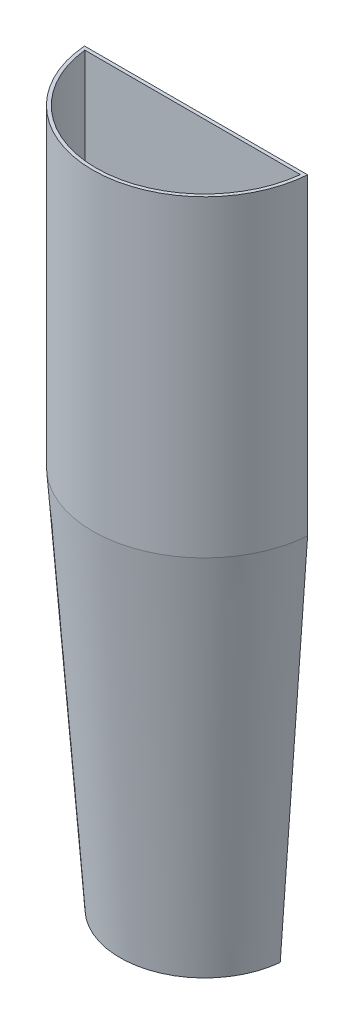
ISO-10303-21;
HEADER;
FILE_DESCRIPTION(('STEP AP214'),'2;1');
FILE_NAME('part.step','',(''),(''),'','','');
FILE_SCHEMA(('AUTOMOTIVE_DESIGN { 1 0 10303 214 1 1 1 1 }'));
ENDSEC;
DATA;
#1=APPLICATION_CONTEXT('core data for automotive mechanical design processes');
#2=APPLICATION_PROTOCOL_DEFINITION('international standard','automotive_design',2000,#1);
#3=PRODUCT_CONTEXT('',#1,'mechanical');
#4=PRODUCT('Part','Part','',(#3));
#5=PRODUCT_RELATED_PRODUCT_CATEGORY('part','',(#4));
#6=PRODUCT_DEFINITION_FORMATION('','',#4);
#7=PRODUCT_DEFINITION_CONTEXT('part definition',#1,'design');
#8=PRODUCT_DEFINITION('design','',#6,#7);
#9=PRODUCT_DEFINITION_SHAPE('','',#8);
#10=(LENGTH_UNIT() NAMED_UNIT(*) SI_UNIT(.MILLI.,.METRE.));
#11=(NAMED_UNIT(*) PLANE_ANGLE_UNIT() SI_UNIT($,.RADIAN.));
#12=(NAMED_UNIT(*) SI_UNIT($,.STERADIAN.) SOLID_ANGLE_UNIT());
#13=UNCERTAINTY_MEASURE_WITH_UNIT(LENGTH_MEASURE(1.E-05),#10,'distance_accuracy_value','');
#14=(GEOMETRIC_REPRESENTATION_CONTEXT(3) GLOBAL_UNCERTAINTY_ASSIGNED_CONTEXT((#13)) GLOBAL_UNIT_ASSIGNED_CONTEXT((#10,
#11,#12)) REPRESENTATION_CONTEXT('',''));
#15=CARTESIAN_POINT('',(0.,0.,0.));
#16=DIRECTION('',(0.,0.,1.));
#17=DIRECTION('',(1.,0.,0.));
#18=AXIS2_PLACEMENT_3D('',#15,#16,#17);
#19=CARTESIAN_POINT('',(15.85,91.39,-1.66990534356155E-13));
#20=DIRECTION('',(0.,1.,0.));
#21=DIRECTION('',(0.,0.,1.));
#22=AXIS2_PLACEMENT_3D('',#19,#20,#21);
#23=PLANE('',#22);
#24=DIRECTION('',(1.,0.,0.));
#25=VECTOR('',#24,1.);
#26=CARTESIAN_POINT('',(15.85,91.39,2.50000000000001));
#27=LINE('',#26,#25);
#28=CARTESIAN_POINT('',(-32.6042941957037,91.39,2.50000000000001));
#29=VERTEX_POINT('',#28);
#30=CARTESIAN_POINT('',(32.6042941957037,91.39,2.50000000000001));
#31=VERTEX_POINT('',#30);
#32=EDGE_CURVE('E36',#29,#31,#27,.T.);
#33=ORIENTED_EDGE('',*,*,#32,.F.);
#34=CARTESIAN_POINT('',(0.,91.39,0.));
#35=DIRECTION('',(0.,1.,0.));
#36=DIRECTION('',(0.,0.,1.));
#37=AXIS2_PLACEMENT_3D('',#34,#35,#36);
#38=CIRCLE('',#37,32.7);
#39=EDGE_CURVE('E105',#31,#29,#38,.F.);
#40=ORIENTED_EDGE('',*,*,#39,.F.);
#41=EDGE_LOOP('',(#33,#40));
#42=FACE_BOUND('',#41,.T.);
#43=CARTESIAN_POINT('',(0.,91.39,0.));
#44=DIRECTION('',(0.,-1.,0.));
#45=DIRECTION('',(0.,0.,-1.));
#46=AXIS2_PLACEMENT_3D('',#43,#44,#45);
#47=CIRCLE('',#46,31.7);
#48=CARTESIAN_POINT('',(31.5061898680243,91.39,3.50000000000001));
#49=VERTEX_POINT('',#48);
#50=CARTESIAN_POINT('',(-31.5061898680243,91.39,3.50000000000001));
#51=VERTEX_POINT('',#50);
#52=EDGE_CURVE('E177',#49,#51,#47,.T.);
#53=ORIENTED_EDGE('',*,*,#52,.T.);
#54=DIRECTION('',(1.,0.,0.));
#55=VECTOR('',#54,1.);
#56=CARTESIAN_POINT('',(-31.7,91.39,3.50000000000001));
#57=LINE('',#56,#55);
#58=EDGE_CURVE('E49',#51,#49,#57,.T.);
#59=ORIENTED_EDGE('',*,*,#58,.T.);
#60=EDGE_LOOP('',(#53,#59));
#61=FACE_BOUND('',#60,.T.);
#62=ADVANCED_FACE('F32',(#42,#61),#23,.T.);
#63=CARTESIAN_POINT('',(0.,91.39,0.));
#64=DIRECTION('',(0.,-1.,0.));
#65=DIRECTION('',(0.,0.,-1.));
#66=AXIS2_PLACEMENT_3D('',#63,#64,#65);
#67=CYLINDRICAL_SURFACE('',#66,32.7);
#68=DIRECTION('',(0.,-1.,0.));
#69=VECTOR('',#68,1.);
#70=CARTESIAN_POINT('',(-32.6042941957037,-0.0355406361223097,2.50000000000001));
#71=LINE('',#70,#69);
#72=CARTESIAN_POINT('',(-32.6042941957037,-0.0355406361223097,2.50000000000001));
#73=VERTEX_POINT('',#72);
#74=EDGE_CURVE('E72',#73,#29,#71,.F.);
#75=ORIENTED_EDGE('',*,*,#74,.F.);
#76=CARTESIAN_POINT('',(0.,-0.0355406361223057,0.));
#77=DIRECTION('',(0.,1.,0.));
#78=DIRECTION('',(-1.,0.,0.));
#79=AXIS2_PLACEMENT_3D('',#76,#77,#78);
#80=CIRCLE('',#79,32.7);
#81=CARTESIAN_POINT('',(32.6042941957037,-0.0355406361223017,2.50000000000001));
#82=VERTEX_POINT('',#81);
#83=EDGE_CURVE('E41',#82,#73,#80,.F.);
#84=ORIENTED_EDGE('',*,*,#83,.F.);
#85=DIRECTION('',(0.,-1.,0.));
#86=VECTOR('',#85,1.);
#87=CARTESIAN_POINT('',(32.6042941957037,91.39,2.50000000000001));
#88=LINE('',#87,#86);
#89=EDGE_CURVE('E88',#31,#82,#88,.T.);
#90=ORIENTED_EDGE('',*,*,#89,.F.);
#91=ORIENTED_EDGE('',*,*,#39,.T.);
#92=EDGE_LOOP('',(#75,#84,#90,#91));
#93=FACE_BOUND('',#92,.T.);
#94=ADVANCED_FACE('F104',(#93),#67,.T.);
#95=CARTESIAN_POINT('',(0.,-0.0709916001408615,0.));
#96=DIRECTION('',(0.,1.,0.));
#97=DIRECTION('',(-1.,0.,0.));
#98=AXIS2_PLACEMENT_3D('',#95,#96,#97);
#99=CONICAL_SURFACE('',#98,32.6974769133717,0.0710513664491259);
#100=ORIENTED_EDGE('',*,*,#83,.T.);
#101=CARTESIAN_POINT('',(-32.6042941957037,-0.0355406361223097,2.50000000000001));
#102=CARTESIAN_POINT('',(-31.8796646662161,-10.1871954413246,2.50000000000001));
#103=CARTESIAN_POINT('',(-31.1549014916547,-20.3388407097097,2.50000000000001));
#104=CARTESIAN_POINT('',(-29.7050277711915,-40.6421064230403,2.50000000000001));
#105=CARTESIAN_POINT('',(-28.9799172252902,-50.7937268679859,2.50000000000001));
#106=CARTESIAN_POINT('',(-27.6466218046849,-69.4544682615629,2.50000000000001));
#107=CARTESIAN_POINT('',(-27.0385004948218,-77.9635937516011,2.50000000000001));
#108=CARTESIAN_POINT('',(-25.8218855314386,-94.9818181245981,2.50000000000001));
#109=CARTESIAN_POINT('',(-25.2133918779179,-103.490917007557,2.50000000000001));
#110=CARTESIAN_POINT('',(-24.6046760442116,-112.,2.50000000000001));
#111=B_SPLINE_CURVE_WITH_KNOTS('',3,(#101,#102,#103,#104,#105,#106,#107,#108,#109,#110),
.UNSPECIFIED.,.F.,.F.,(4,2,2,2,4),(0.,30.5324523966678,61.0649047427838,86.6573890459346,
112.24987338471),.UNSPECIFIED.);
#112=CARTESIAN_POINT('',(-24.6046760442116,-112.,2.50000000000001));
#113=VERTEX_POINT('',#112);
#114=EDGE_CURVE('E94',#73,#113,#111,.T.);
#115=ORIENTED_EDGE('',*,*,#114,.T.);
#116=CARTESIAN_POINT('',(0.,-112.,0.));
#117=DIRECTION('',(0.,1.,0.));
#118=DIRECTION('',(-1.,0.,0.));
#119=AXIS2_PLACEMENT_3D('',#116,#117,#118);
#120=CIRCLE('',#119,24.7313582975258);
#121=CARTESIAN_POINT('',(24.6046760442116,-112.,2.50000000000001));
#122=VERTEX_POINT('',#121);
#123=EDGE_CURVE('E102',#122,#113,#120,.F.);
#124=ORIENTED_EDGE('',*,*,#123,.F.);
#125=CARTESIAN_POINT('',(24.6046760442116,-112.,2.50000000000001));
#126=CARTESIAN_POINT('',(25.1539194026096,-104.322280968585,2.50000000000001));
#127=CARTESIAN_POINT('',(25.7029806349068,-96.6445489109409,2.50000000000001));
#128=CARTESIAN_POINT('',(26.8007940003568,-81.2890627067109,2.50000000000001));
#129=CARTESIAN_POINT('',(27.3495461335101,-73.6113085601257,2.50000000000001));
#130=CARTESIAN_POINT('',(28.6829744699763,-54.9505766646192,2.50000000000001));
#131=CARTESIAN_POINT('',(29.4675178216802,-43.9675894230161,2.50000000000001));
#132=CARTESIAN_POINT('',(31.0361903112646,-22.0015853383224,2.50000000000001));
#133=CARTESIAN_POINT('',(31.8203194491444,-11.0185684952317,2.50000000000001));
#134=CARTESIAN_POINT('',(32.6042941957037,-0.0355406361223134,2.50000000000001));
#135=B_SPLINE_CURVE_WITH_KNOTS('',3,(#125,#126,#127,#128,#129,#130,#131,#132,#133,#134),
.UNSPECIFIED.,.F.,.F.,(4,2,2,2,4),(0.,23.0920189644888,46.1840378992673,79.2169556116259,
112.249873384733),.UNSPECIFIED.);
#136=EDGE_CURVE('E58',#122,#82,#135,.T.);
#137=ORIENTED_EDGE('',*,*,#136,.T.);
#138=EDGE_LOOP('',(#100,#115,#124,#137));
#139=FACE_BOUND('',#138,.T.);
#140=ADVANCED_FACE('F99',(#139),#99,.T.);
#141=CARTESIAN_POINT('',(15.85,-112.,-1.17718836523291E-13));
#142=DIRECTION('',(0.,1.,0.));
#143=DIRECTION('',(-1.,0.,0.));
#144=AXIS2_PLACEMENT_3D('',#141,#142,#143);
#145=PLANE('',#144);
#146=ORIENTED_EDGE('',*,*,#123,.T.);
#147=DIRECTION('',(1.,0.,0.));
#148=VECTOR('',#147,1.);
#149=CARTESIAN_POINT('',(15.85,-112.,2.50000000000001));
#150=LINE('',#149,#148);
#151=EDGE_CURVE('E11',#113,#122,#150,.T.);
#152=ORIENTED_EDGE('',*,*,#151,.T.);
#153=EDGE_LOOP('',(#146,#152));
#154=FACE_BOUND('',#153,.T.);
#155=ADVANCED_FACE('F34',(#154),#145,.F.);
#156=CARTESIAN_POINT('',(-31.7,-111.,2.50000000000001));
#157=DIRECTION('',(0.,0.,1.));
#158=DIRECTION('',(1.,0.,0.));
#159=AXIS2_PLACEMENT_3D('',#156,#157,#158);
#160=PLANE('',#159);
#161=ORIENTED_EDGE('',*,*,#74,.T.);
#162=ORIENTED_EDGE('',*,*,#32,.T.);
#163=ORIENTED_EDGE('',*,*,#89,.T.);
#164=ORIENTED_EDGE('',*,*,#136,.F.);
#165=ORIENTED_EDGE('',*,*,#151,.F.);
#166=ORIENTED_EDGE('',*,*,#114,.F.);
#167=EDGE_LOOP('',(#161,#162,#163,#164,#165,#166));
#168=FACE_BOUND('',#167,.T.);
#169=ADVANCED_FACE('F89',(#168),#160,.F.);
#170=CARTESIAN_POINT('',(0.,91.39,0.));
#171=DIRECTION('',(0.,-1.,0.));
#172=DIRECTION('',(0.,0.,-1.));
#173=AXIS2_PLACEMENT_3D('',#170,#171,#172);
#174=CYLINDRICAL_SURFACE('',#173,31.7);
#175=DIRECTION('',(0.,-1.,0.));
#176=VECTOR('',#175,1.);
#177=CARTESIAN_POINT('',(-31.5061898680243,91.39,3.50000000000001));
#178=LINE('',#177,#176);
#179=CARTESIAN_POINT('',(-31.5061898680244,0.,3.50000000000001));
#180=VERTEX_POINT('',#179);
#181=EDGE_CURVE('E158',#180,#51,#178,.F.);
#182=ORIENTED_EDGE('',*,*,#181,.T.);
#183=ORIENTED_EDGE('',*,*,#52,.F.);
#184=DIRECTION('',(0.,-1.,0.));
#185=VECTOR('',#184,1.);
#186=CARTESIAN_POINT('',(31.5061898680243,91.39,3.50000000000001));
#187=LINE('',#186,#185);
#188=CARTESIAN_POINT('',(31.5061898680243,0.,3.50000000000001));
#189=VERTEX_POINT('',#188);
#190=EDGE_CURVE('E159',#49,#189,#187,.T.);
#191=ORIENTED_EDGE('',*,*,#190,.T.);
#192=CARTESIAN_POINT('',(0.,0.,0.));
#193=DIRECTION('',(0.,-1.,0.));
#194=DIRECTION('',(0.,0.,-1.));
#195=AXIS2_PLACEMENT_3D('',#192,#193,#194);
#196=CIRCLE('',#195,31.7);
#197=EDGE_CURVE('E175',#189,#180,#196,.T.);
#198=ORIENTED_EDGE('',*,*,#197,.T.);
#199=EDGE_LOOP('',(#182,#183,#191,#198));
#200=FACE_BOUND('',#199,.T.);
#201=ADVANCED_FACE('F120',(#200),#174,.F.);
#202=CARTESIAN_POINT('',(0.,0.,0.));
#203=DIRECTION('',(0.,1.,0.));
#204=DIRECTION('',(-1.,0.,0.));
#205=AXIS2_PLACEMENT_3D('',#202,#203,#204);
#206=CONICAL_SURFACE('',#205,31.7,0.0710513664491259);
#207=ORIENTED_EDGE('',*,*,#197,.F.);
#208=CARTESIAN_POINT('',(7.40743215241588,-330.292685025087,3.50000000000001));
#209=CARTESIAN_POINT('',(7.60750375181691,-327.750668811219,3.50000000000001));
#210=CARTESIAN_POINT('',(7.80615851352526,-325.208541645593,3.50000000000001));
#211=CARTESIAN_POINT('',(8.20112208021932,-320.124106876988,3.50000000000001));
#212=CARTESIAN_POINT('',(8.39743088692407,-317.581799274141,3.50000000000001));
#213=CARTESIAN_POINT('',(8.98357085077345,-309.954656393766,3.50000000000001));
#214=CARTESIAN_POINT('',(9.37061507972266,-304.869607070101,3.50000000000001));
#215=CARTESIAN_POINT('',(10.1396288583504,-294.699124401394,3.50000000000001));
#216=CARTESIAN_POINT('',(10.5215984068358,-289.613691056262,3.50000000000001));
#217=CARTESIAN_POINT('',(11.2818815336817,-279.442544511999,3.50000000000001));
#218=CARTESIAN_POINT('',(11.6601951072089,-274.356831312507,3.50000000000001));
#219=CARTESIAN_POINT('',(12.4141007246417,-264.185203899083,3.50000000000001));
#220=CARTESIAN_POINT('',(12.7896927688346,-259.099289685172,3.50000000000001));
#221=CARTESIAN_POINT('',(13.6242719984877,-247.76664358281,3.50000000000001));
#222=CARTESIAN_POINT('',(14.0827301927276,-241.519872751137,3.50000000000001));
#223=CARTESIAN_POINT('',(14.9973186309021,-229.026160620422,3.50000000000001));
#224=CARTESIAN_POINT('',(15.4534488747787,-222.779219321376,3.50000000000001));
#225=CARTESIAN_POINT('',(16.3639280898085,-210.28520630358,3.50000000000001));
#226=CARTESIAN_POINT('',(16.8182770607775,-204.038134584818,3.50000000000001));
#227=CARTESIAN_POINT('',(17.7255788428913,-191.543889746126,3.50000000000001));
#228=CARTESIAN_POINT('',(18.1785316540264,-185.296716626196,3.50000000000001));
#229=CARTESIAN_POINT('',(19.535735960926,-166.555084469971,3.50000000000001));
#230=CARTESIAN_POINT('',(20.4383338353965,-154.060505694784,3.50000000000001));
#231=CARTESIAN_POINT('',(22.2406114924065,-129.071138450109,3.50000000000001));
#232=CARTESIAN_POINT('',(23.1402912750919,-116.576349980632,3.50000000000001));
#233=CARTESIAN_POINT('',(24.5813167812165,-96.5402479786103,3.50000000000001));
#234=CARTESIAN_POINT('',(25.1233180366835,-88.9989815827312,3.50000000000001));
#235=CARTESIAN_POINT('',(26.2066983868687,-73.916403614667,3.50000000000001));
#236=CARTESIAN_POINT('',(26.7480774815469,-66.375092042479,3.50000000000001));
#237=CARTESIAN_POINT('',(28.3714450659446,-43.7511010838688,3.50000000000001));
#238=CARTESIAN_POINT('',(29.4526637835156,-28.668366464035,3.50000000000001));
#239=CARTESIAN_POINT('',(31.6136391081764,1.49720755546604,3.50000000000001));
#240=CARTESIAN_POINT('',(32.6933957152603,16.5800469551336,3.50000000000001));
#241=CARTESIAN_POINT('',(34.8518277838313,46.7458005638999,3.50000000000001));
#242=CARTESIAN_POINT('',(35.9305032454998,61.8287147729857,3.50000000000001));
#243=CARTESIAN_POINT('',(38.0870165379709,91.9946029503444,3.50000000000001));
#244=CARTESIAN_POINT('',(39.1648543687804,107.077576918617,3.50000000000001));
#245=CARTESIAN_POINT('',(40.2423950596724,122.160572100045,3.50000000000001));
#246=B_SPLINE_CURVE_WITH_KNOTS('',3,(#208,#209,#210,#211,#212,#213,#214,#215,#216,#217,#218,
#219,#220,#221,#222,#223,#224,#225,#226,#227,#228,#229,#230,#231,#232,#233,#234,#235,#236,#237,
#238,#239,#240,#241,#242,#243,#244,#245),.UNSPECIFIED.,.F.,.F.,(4,2,2,2,2,2,2,2,2,2,2,2,2,2,2,2,
2,2,4),(0.,7.6496311639932,15.2992567222061,30.5985259710737,45.8977988168493,61.1970918862972,
76.4963833411445,95.2870976535314,114.077812432906,132.868529153757,151.659246005518,
189.240658826593,226.822069767094,249.504225236098,272.186382166761,317.5506990618,
362.915016139829,408.2793256101,453.643634709232),.UNSPECIFIED.);
#247=CARTESIAN_POINT('',(23.5412404091203,-111.,3.50000000000001));
#248=VERTEX_POINT('',#247);
#249=EDGE_CURVE('E81',#248,#189,#246,.T.);
#250=ORIENTED_EDGE('',*,*,#249,.F.);
#251=CARTESIAN_POINT('',(0.,-111.,0.));
#252=DIRECTION('',(0.,-1.,0.));
#253=DIRECTION('',(1.,0.,0.));
#254=AXIS2_PLACEMENT_3D('',#251,#252,#253);
#255=CIRCLE('',#254,23.8);
#256=CARTESIAN_POINT('',(-23.5412404091203,-111.,3.50000000000001));
#257=VERTEX_POINT('',#256);
#258=EDGE_CURVE('E173',#248,#257,#255,.T.);
#259=ORIENTED_EDGE('',*,*,#258,.T.);
#260=CARTESIAN_POINT('',(-40.2423950596724,122.160572100045,3.50000000000001));
#261=CARTESIAN_POINT('',(-39.3465173705602,109.620285653953,3.50000000000001));
#262=CARTESIAN_POINT('',(-38.4504210619645,97.0800148318209,3.50000000000001));
#263=CARTESIAN_POINT('',(-36.6576756912509,71.9995127012511,3.50000000000001));
#264=CARTESIAN_POINT('',(-35.7610266291331,59.4592813928135,3.50000000000001));
#265=CARTESIAN_POINT('',(-33.0638802866912,21.7520258748185,3.50000000000001));
#266=CARTESIAN_POINT('',(-31.2623713544485,-3.41492601090793,3.50000000000001));
#267=CARTESIAN_POINT('',(-28.5567376289613,-41.1651125123606,3.50000000000001));
#268=CARTESIAN_POINT('',(-27.6542979913087,-53.7484679025743,3.50000000000001));
#269=CARTESIAN_POINT('',(-25.8479006525509,-78.9150697128675,3.50000000000001));
#270=CARTESIAN_POINT('',(-24.9439429514504,-91.4983161329474,3.50000000000001));
#271=CARTESIAN_POINT('',(-23.7677505235625,-107.852107284574,3.50000000000001));
#272=CARTESIAN_POINT('',(-23.4964672717739,-111.622720452277,3.50000000000001));
#273=CARTESIAN_POINT('',(-22.9536904175588,-119.16393156396,3.50000000000001));
#274=CARTESIAN_POINT('',(-22.6821968151371,-122.934529507941,3.50000000000001));
#275=CARTESIAN_POINT('',(-22.1389762058839,-130.475708261681,3.50000000000001));
#276=CARTESIAN_POINT('',(-21.8672491990722,-134.246289071442,3.50000000000001));
#277=CARTESIAN_POINT('',(-21.3235338138977,-141.787432114427,3.50000000000001));
#278=CARTESIAN_POINT('',(-21.0515454355162,-145.557994347648,3.50000000000001));
#279=CARTESIAN_POINT('',(-20.2351415352737,-156.869660895256,3.50000000000001));
#280=CARTESIAN_POINT('',(-19.6902880726426,-164.410733611433,3.50000000000001));
#281=CARTESIAN_POINT('',(-18.5990915633281,-179.492771062005,3.50000000000001));
#282=CARTESIAN_POINT('',(-18.0527485166898,-187.033735796404,3.50000000000001));
#283=CARTESIAN_POINT('',(-16.9581174807653,-202.115520824899,3.50000000000001));
#284=CARTESIAN_POINT('',(-16.4098294923346,-209.656341119057,3.50000000000001));
#285=CARTESIAN_POINT('',(-15.3106405068664,-224.737792378321,3.50000000000001));
#286=CARTESIAN_POINT('',(-14.7597395094645,-232.2784233434,3.50000000000001));
#287=CARTESIAN_POINT('',(-13.6543235125184,-247.359435734908,3.50000000000001));
#288=CARTESIAN_POINT('',(-13.0998085058046,-254.899817160811,3.50000000000001));
#289=CARTESIAN_POINT('',(-12.2640818931984,-266.210095668356,3.50000000000001));
#290=CARTESIAN_POINT('',(-11.9848473939698,-269.98013882302,3.50000000000001));
#291=CARTESIAN_POINT('',(-11.4247434951839,-277.520103961594,3.50000000000001));
#292=CARTESIAN_POINT('',(-11.1438740955304,-281.290025945498,3.50000000000001));
#293=CARTESIAN_POINT('',(-10.5800953809307,-288.8297251258,3.50000000000001));
#294=CARTESIAN_POINT('',(-10.2971860618677,-292.59950232189,3.50000000000001));
#295=CARTESIAN_POINT('',(-9.72876562909951,-300.138860036838,3.50000000000001));
#296=CARTESIAN_POINT('',(-9.44325451582753,-303.908440555729,3.50000000000001));
#297=CARTESIAN_POINT('',(-8.86883998816778,-311.447348606997,3.50000000000001));
#298=CARTESIAN_POINT('',(-8.57993656925558,-315.21667613903,3.50000000000001));
#299=CARTESIAN_POINT('',(-8.14314958758463,-320.870403416866,3.50000000000001));
#300=CARTESIAN_POINT('',(-7.9969819096127,-322.754935706232,3.50000000000001));
#301=CARTESIAN_POINT('',(-7.7032837963491,-326.523894351161,3.50000000000001));
#302=CARTESIAN_POINT('',(-7.55575336085165,-328.408320706708,3.50000000000001));
#303=CARTESIAN_POINT('',(-7.40743215241579,-330.292685025087,3.50000000000001));
#304=B_SPLINE_CURVE_WITH_KNOTS('',3,(#260,#261,#262,#263,#264,#265,#266,#267,#268,#269,#270,
#271,#272,#273,#274,#275,#276,#277,#278,#279,#280,#281,#282,#283,#284,#285,#286,#287,#288,#289,
#290,#291,#292,#293,#294,#295,#296,#297,#298,#299,#300,#301,#302,#303),.UNSPECIFIED.,.F.,.F.,(4,
2,2,2,2,2,2,2,2,2,2,2,2,2,2,2,2,2,2,2,2,4),(0.,37.7167393558664,75.4334787051001,
151.127521188389,188.974543097262,226.821564887151,238.162643507196,249.503721874574,
260.844799278392,272.185877487397,294.868068332794,317.550258493489,340.232438680096,
362.914622029106,385.596850389298,396.937960101213,408.27907048106,419.620203754623,
430.96133513977,442.302481652719,447.973058119773,453.643635443212),.UNSPECIFIED.);
#305=EDGE_CURVE('E152',#180,#257,#304,.T.);
#306=ORIENTED_EDGE('',*,*,#305,.F.);
#307=EDGE_LOOP('',(#207,#250,#259,#306));
#308=FACE_BOUND('',#307,.T.);
#309=ADVANCED_FACE('F137',(#308),#206,.F.);
#310=CARTESIAN_POINT('',(15.85,-111.,-1.17718836523291E-13));
#311=DIRECTION('',(0.,1.,0.));
#312=DIRECTION('',(-1.,0.,0.));
#313=AXIS2_PLACEMENT_3D('',#310,#311,#312);
#314=PLANE('',#313);
#315=ORIENTED_EDGE('',*,*,#258,.F.);
#316=DIRECTION('',(1.,0.,0.));
#317=VECTOR('',#316,1.);
#318=CARTESIAN_POINT('',(15.85,-111.,3.50000000000001));
#319=LINE('',#318,#317);
#320=EDGE_CURVE('E176',#257,#248,#319,.T.);
#321=ORIENTED_EDGE('',*,*,#320,.F.);
#322=EDGE_LOOP('',(#315,#321));
#323=FACE_BOUND('',#322,.T.);
#324=ADVANCED_FACE('F142',(#323),#314,.T.);
#325=CARTESIAN_POINT('',(-31.7,-111.,3.50000000000001));
#326=DIRECTION('',(0.,0.,1.));
#327=DIRECTION('',(1.,0.,0.));
#328=AXIS2_PLACEMENT_3D('',#325,#326,#327);
#329=PLANE('',#328);
#330=ORIENTED_EDGE('',*,*,#181,.F.);
#331=ORIENTED_EDGE('',*,*,#305,.T.);
#332=ORIENTED_EDGE('',*,*,#320,.T.);
#333=ORIENTED_EDGE('',*,*,#249,.T.);
#334=ORIENTED_EDGE('',*,*,#190,.F.);
#335=ORIENTED_EDGE('',*,*,#58,.F.);
#336=EDGE_LOOP('',(#330,#331,#332,#333,#334,#335));
#337=FACE_BOUND('',#336,.T.);
#338=ADVANCED_FACE('F161',(#337),#329,.T.);
#339=CLOSED_SHELL('',(#62,#94,#140,#155,#169,#201,#309,#324,#338));
#340=MANIFOLD_SOLID_BREP('B2',#339);
#341=ADVANCED_BREP_SHAPE_REPRESENTATION('',(#18,#340),#14);
#342=SHAPE_DEFINITION_REPRESENTATION(#9,#341);
ENDSEC;
END-ISO-10303-21;
